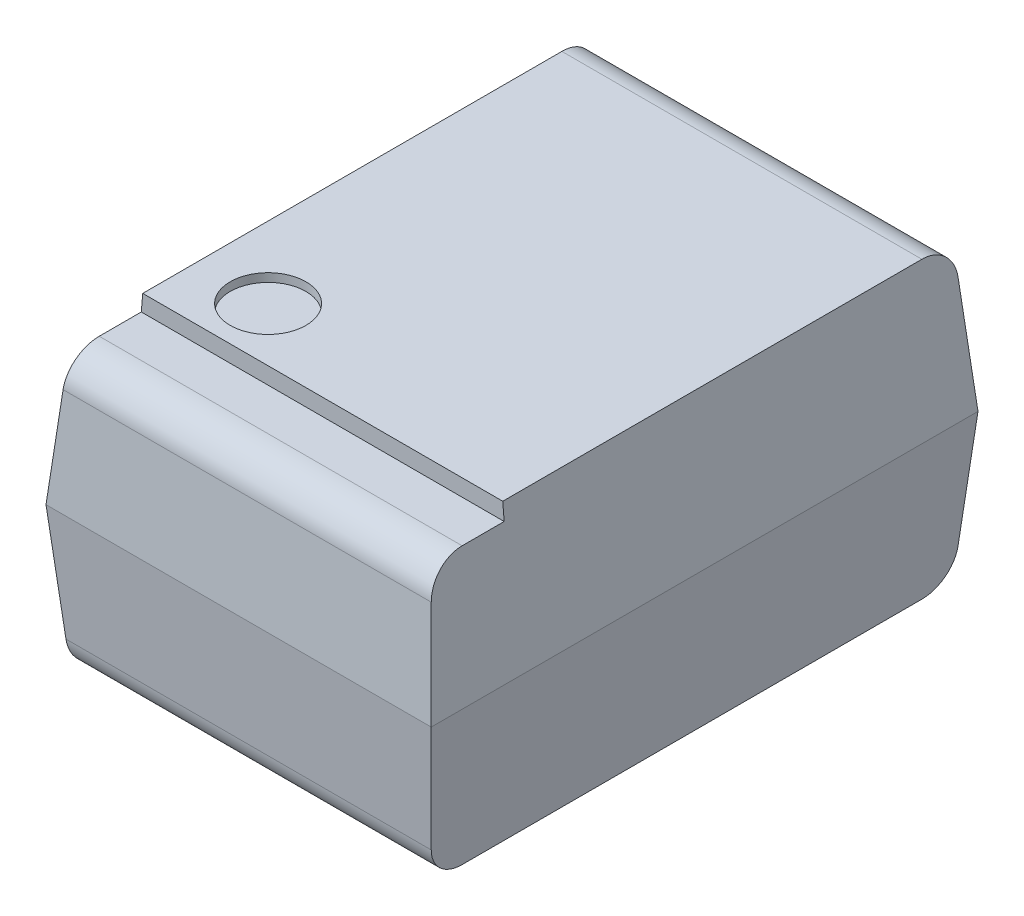
ISO-10303-21;
HEADER;
FILE_DESCRIPTION(('STEP AP214'),'2;1');
FILE_NAME('part.step','',(''),(''),'','','');
FILE_SCHEMA(('AUTOMOTIVE_DESIGN { 1 0 10303 214 1 1 1 1 }'));
ENDSEC;
DATA;
#1=APPLICATION_CONTEXT('core data for automotive mechanical design processes');
#2=APPLICATION_PROTOCOL_DEFINITION('international standard','automotive_design',2000,#1);
#3=PRODUCT_CONTEXT('',#1,'mechanical');
#4=PRODUCT('Part','Part','',(#3));
#5=PRODUCT_RELATED_PRODUCT_CATEGORY('part','',(#4));
#6=PRODUCT_DEFINITION_FORMATION('','',#4);
#7=PRODUCT_DEFINITION_CONTEXT('part definition',#1,'design');
#8=PRODUCT_DEFINITION('design','',#6,#7);
#9=PRODUCT_DEFINITION_SHAPE('','',#8);
#10=(LENGTH_UNIT() NAMED_UNIT(*) SI_UNIT(.MILLI.,.METRE.));
#11=(NAMED_UNIT(*) PLANE_ANGLE_UNIT() SI_UNIT($,.RADIAN.));
#12=(NAMED_UNIT(*) SI_UNIT($,.STERADIAN.) SOLID_ANGLE_UNIT());
#13=UNCERTAINTY_MEASURE_WITH_UNIT(LENGTH_MEASURE(1.E-05),#10,'distance_accuracy_value','');
#14=(GEOMETRIC_REPRESENTATION_CONTEXT(3) GLOBAL_UNCERTAINTY_ASSIGNED_CONTEXT((#13)) GLOBAL_UNIT_ASSIGNED_CONTEXT((#10,
#11,#12)) REPRESENTATION_CONTEXT('',''));
#15=CARTESIAN_POINT('',(0.,0.,0.));
#16=DIRECTION('',(0.,0.,1.));
#17=DIRECTION('',(1.,0.,0.));
#18=AXIS2_PLACEMENT_3D('',#15,#16,#17);
#19=CARTESIAN_POINT('',(0.,-1.65,0.));
#20=DIRECTION('',(0.,1.,0.));
#21=DIRECTION('',(0.,0.,1.));
#22=AXIS2_PLACEMENT_3D('',#19,#20,#21);
#23=PLANE('',#22);
#24=CARTESIAN_POINT('',(0.,-1.65,0.));
#25=DIRECTION('',(0.,1.,0.));
#26=DIRECTION('',(0.,0.,1.));
#27=AXIS2_PLACEMENT_3D('',#24,#25,#26);
#28=CIRCLE('',#27,1.5);
#29=CARTESIAN_POINT('',(0.,-1.65,1.5));
#30=VERTEX_POINT('',#29);
#31=EDGE_CURVE('E20',#30,#30,#28,.F.);
#32=ORIENTED_EDGE('',*,*,#31,.T.);
#33=EDGE_LOOP('',(#32));
#34=FACE_BOUND('',#33,.T.);
#35=ADVANCED_FACE('F17',(#34),#23,.F.);
#36=CARTESIAN_POINT('',(2.29,0.,3.25));
#37=DIRECTION('',(0.,-0.0854011413464188,0.996346649041753));
#38=DIRECTION('',(0.,-0.996346649041753,-0.0854011413464188));
#39=AXIS2_PLACEMENT_3D('',#36,#37,#38);
#40=PLANE('',#39);
#41=DIRECTION('',(-1.,0.,0.));
#42=VECTOR('',#41,1.);
#43=CARTESIAN_POINT('',(1.145,-1.38416045653897,3.13135767515367));
#44=LINE('',#43,#42);
#45=CARTESIAN_POINT('',(2.17135767515393,-1.38416045653877,3.13135767515372));
#46=VERTEX_POINT('',#45);
#47=CARTESIAN_POINT('',(-2.17135767515393,-1.38416045653877,3.13135767515372));
#48=VERTEX_POINT('',#47);
#49=EDGE_CURVE('E143',#46,#48,#44,.T.);
#50=ORIENTED_EDGE('',*,*,#49,.F.);
#51=DIRECTION('',(0.0850914041694685,0.992733048645463,0.0850914041695941));
#52=VECTOR('',#51,1.);
#53=CARTESIAN_POINT('',(2.171357675154,-1.38416045653899,3.13135767515383));
#54=LINE('',#53,#52);
#55=CARTESIAN_POINT('',(2.29,0.,3.25));
#56=VERTEX_POINT('',#55);
#57=EDGE_CURVE('E106',#46,#56,#54,.T.);
#58=ORIENTED_EDGE('',*,*,#57,.T.);
#59=DIRECTION('',(1.,0.,0.));
#60=VECTOR('',#59,1.);
#61=CARTESIAN_POINT('',(-2.29,0.,3.25));
#62=LINE('',#61,#60);
#63=CARTESIAN_POINT('',(-2.29,0.,3.25));
#64=VERTEX_POINT('',#63);
#65=EDGE_CURVE('E120',#64,#56,#62,.T.);
#66=ORIENTED_EDGE('',*,*,#65,.F.);
#67=DIRECTION('',(0.0850914041694688,-0.992733048645463,-0.0850914041695941));
#68=VECTOR('',#67,1.);
#69=CARTESIAN_POINT('',(-2.29,0.,3.25));
#70=LINE('',#69,#68);
#71=EDGE_CURVE('E111',#64,#48,#70,.T.);
#72=ORIENTED_EDGE('',*,*,#71,.T.);
#73=EDGE_LOOP('',(#50,#58,#66,#72));
#74=FACE_BOUND('',#73,.T.);
#75=ADVANCED_FACE('F121',(#74),#40,.T.);
#76=CARTESIAN_POINT('',(-2.29,0.,3.25));
#77=DIRECTION('',(0.,0.0854011413464188,0.996346649041753));
#78=DIRECTION('',(0.,-0.996346649041753,0.0854011413464188));
#79=AXIS2_PLACEMENT_3D('',#76,#77,#78);
#80=PLANE('',#79);
#81=DIRECTION('',(-1.,0.,0.));
#82=VECTOR('',#81,1.);
#83=CARTESIAN_POINT('',(-2.2905,1.18416045653897,3.14850053229667));
#84=LINE('',#83,#82);
#85=CARTESIAN_POINT('',(-2.18850053229686,1.18416045653877,3.14850053229669));
#86=VERTEX_POINT('',#85);
#87=CARTESIAN_POINT('',(2.18850053229686,1.18416045653877,3.14850053229669));
#88=VERTEX_POINT('',#87);
#89=EDGE_CURVE('E136',#86,#88,#84,.F.);
#90=ORIENTED_EDGE('',*,*,#89,.F.);
#91=DIRECTION('',(-0.0850914041693264,-0.992733048645475,0.0850914041695951));
#92=VECTOR('',#91,1.);
#93=CARTESIAN_POINT('',(-2.188500532297,1.18416045653897,3.14850053229668));
#94=LINE('',#93,#92);
#95=EDGE_CURVE('E129',#86,#64,#94,.T.);
#96=ORIENTED_EDGE('',*,*,#95,.T.);
#97=ORIENTED_EDGE('',*,*,#65,.T.);
#98=DIRECTION('',(-0.0850914041693268,0.992733048645475,-0.0850914041695951));
#99=VECTOR('',#98,1.);
#100=CARTESIAN_POINT('',(2.29,0.,3.25));
#101=LINE('',#100,#99);
#102=EDGE_CURVE('E125',#56,#88,#101,.T.);
#103=ORIENTED_EDGE('',*,*,#102,.T.);
#104=EDGE_LOOP('',(#90,#96,#97,#103));
#105=FACE_BOUND('',#104,.T.);
#106=ADVANCED_FACE('F134',(#105),#80,.T.);
#107=CARTESIAN_POINT('',(0.,-10.43771546495,0.));
#108=DIRECTION('',(0.,1.,0.));
#109=DIRECTION('',(0.,0.,1.));
#110=AXIS2_PLACEMENT_3D('',#107,#108,#109);
#111=CYLINDRICAL_SURFACE('',#110,1.5);
#112=ORIENTED_EDGE('',*,*,#31,.F.);
#113=EDGE_LOOP('',(#112));
#114=FACE_BOUND('',#113,.T.);
#115=CARTESIAN_POINT('',(0.,-1.75,0.));
#116=DIRECTION('',(0.,1.,0.));
#117=DIRECTION('',(0.,0.,1.));
#118=AXIS2_PLACEMENT_3D('',#115,#116,#117);
#119=CIRCLE('',#118,1.5);
#120=CARTESIAN_POINT('',(0.,-1.75,1.5));
#121=VERTEX_POINT('',#120);
#122=EDGE_CURVE('E171',#121,#121,#119,.F.);
#123=ORIENTED_EDGE('',*,*,#122,.T.);
#124=EDGE_LOOP('',(#123));
#125=FACE_BOUND('',#124,.T.);
#126=ADVANCED_FACE('F295',(#114,#125),#111,.F.);
#127=CARTESIAN_POINT('',(-1.145,-1.35,-2.732819015537));
#128=DIRECTION('',(1.,0.,0.));
#129=DIRECTION('',(0.,0.,-1.));
#130=AXIS2_PLACEMENT_3D('',#127,#128,#129);
#131=CYLINDRICAL_SURFACE('',#130,0.4);
#132=CARTESIAN_POINT('',(2.17428571428574,-1.35,-2.732819015537));
#133=DIRECTION('',(0.996346649041753,-0.0854011413464188,0.));
#134=DIRECTION('',(0.0854011413464188,0.996346649041753,0.));
#135=AXIS2_PLACEMENT_3D('',#132,#133,#134);
#136=ELLIPSE('',#135,0.401466698748578,0.4);
#137=CARTESIAN_POINT('',(2.17135767515384,-1.38416045653876,-3.13135767515381));
#138=VERTEX_POINT('',#137);
#139=CARTESIAN_POINT('',(2.14000000000003,-1.75,-2.732819015537));
#140=VERTEX_POINT('',#139);
#141=EDGE_CURVE('E183',#138,#140,#136,.F.);
#142=ORIENTED_EDGE('',*,*,#141,.T.);
#143=DIRECTION('',(1.,0.,0.));
#144=VECTOR('',#143,1.);
#145=CARTESIAN_POINT('',(0.,-1.75,-2.732819015537));
#146=LINE('',#145,#144);
#147=CARTESIAN_POINT('',(-2.14000000000003,-1.75,-2.732819015537));
#148=VERTEX_POINT('',#147);
#149=EDGE_CURVE('E174',#140,#148,#146,.F.);
#150=ORIENTED_EDGE('',*,*,#149,.T.);
#151=CARTESIAN_POINT('',(-2.17428571428574,-1.35,-2.732819015537));
#152=DIRECTION('',(-0.996346649041753,-0.0854011413464188,0.));
#153=DIRECTION('',(0.0854011413464188,-0.996346649041753,0.));
#154=AXIS2_PLACEMENT_3D('',#151,#152,#153);
#155=ELLIPSE('',#154,0.401466698748578,0.4);
#156=CARTESIAN_POINT('',(-2.17135767515393,-1.38416045653878,-3.13135767515376));
#157=VERTEX_POINT('',#156);
#158=EDGE_CURVE('E91',#148,#157,#155,.F.);
#159=ORIENTED_EDGE('',*,*,#158,.T.);
#160=DIRECTION('',(1.,0.,0.));
#161=VECTOR('',#160,1.);
#162=CARTESIAN_POINT('',(-2.29,-1.38416045653899,-3.13135767515383));
#163=LINE('',#162,#161);
#164=EDGE_CURVE('E187',#138,#157,#163,.F.);
#165=ORIENTED_EDGE('',*,*,#164,.F.);
#166=EDGE_LOOP('',(#142,#150,#159,#165));
#167=FACE_BOUND('',#166,.T.);
#168=ADVANCED_FACE('F186',(#167),#131,.T.);
#169=CARTESIAN_POINT('',(1.145,-1.35,2.732819015537));
#170=DIRECTION('',(-1.,0.,0.));
#171=DIRECTION('',(0.,-1.,0.));
#172=AXIS2_PLACEMENT_3D('',#169,#170,#171);
#173=CYLINDRICAL_SURFACE('',#172,0.4);
#174=CARTESIAN_POINT('',(-2.17428571428574,-1.35,2.732819015537));
#175=DIRECTION('',(-0.996346649041753,-0.0854011413464188,0.));
#176=DIRECTION('',(-0.0854011413464188,0.996346649041753,0.));
#177=AXIS2_PLACEMENT_3D('',#174,#175,#176);
#178=ELLIPSE('',#177,0.401466698748578,0.4);
#179=CARTESIAN_POINT('',(-2.14000000000003,-1.75,2.732819015537));
#180=VERTEX_POINT('',#179);
#181=EDGE_CURVE('E116',#48,#180,#178,.F.);
#182=ORIENTED_EDGE('',*,*,#181,.T.);
#183=DIRECTION('',(1.,0.,0.));
#184=VECTOR('',#183,1.);
#185=CARTESIAN_POINT('',(0.,-1.75,2.732819015537));
#186=LINE('',#185,#184);
#187=CARTESIAN_POINT('',(2.14000000000003,-1.75,2.732819015537));
#188=VERTEX_POINT('',#187);
#189=EDGE_CURVE('E202',#180,#188,#186,.T.);
#190=ORIENTED_EDGE('',*,*,#189,.T.);
#191=CARTESIAN_POINT('',(2.17428571428573,-1.35,2.732819015537));
#192=DIRECTION('',(0.996346649041753,-0.0854011413464188,0.));
#193=DIRECTION('',(-0.0854011413464188,-0.996346649041753,0.));
#194=AXIS2_PLACEMENT_3D('',#191,#192,#193);
#195=ELLIPSE('',#194,0.401466698748578,0.4);
#196=EDGE_CURVE('E180',#188,#46,#195,.F.);
#197=ORIENTED_EDGE('',*,*,#196,.T.);
#198=ORIENTED_EDGE('',*,*,#49,.T.);
#199=EDGE_LOOP('',(#182,#190,#197,#198));
#200=FACE_BOUND('',#199,.T.);
#201=ADVANCED_FACE('F304',(#200),#173,.T.);
#202=CARTESIAN_POINT('',(-2.2905,1.15,2.74996187268));
#203=DIRECTION('',(-1.,0.,0.));
#204=DIRECTION('',(0.,0.,1.));
#205=AXIS2_PLACEMENT_3D('',#202,#203,#204);
#206=CYLINDRICAL_SURFACE('',#205,0.4);
#207=CARTESIAN_POINT('',(-2.19142857142859,1.15,2.74996187268));
#208=DIRECTION('',(-0.996346649041753,0.0854011413464188,0.));
#209=DIRECTION('',(-0.0854011413464188,-0.996346649041753,0.));
#210=AXIS2_PLACEMENT_3D('',#207,#208,#209);
#211=ELLIPSE('',#210,0.401466698748578,0.4);
#212=CARTESIAN_POINT('',(-2.15714285714294,1.55,2.74996187268));
#213=VERTEX_POINT('',#212);
#214=EDGE_CURVE('E175',#213,#86,#211,.F.);
#215=ORIENTED_EDGE('',*,*,#214,.T.);
#216=ORIENTED_EDGE('',*,*,#89,.T.);
#217=CARTESIAN_POINT('',(2.19142857142859,1.15,2.74996187268));
#218=DIRECTION('',(0.996346649041753,0.0854011413464188,0.));
#219=DIRECTION('',(-0.0854011413464188,0.996346649041753,0.));
#220=AXIS2_PLACEMENT_3D('',#217,#218,#219);
#221=ELLIPSE('',#220,0.401466698748578,0.4);
#222=CARTESIAN_POINT('',(2.15714285714294,1.55,2.74996187268));
#223=VERTEX_POINT('',#222);
#224=EDGE_CURVE('E177',#88,#223,#221,.F.);
#225=ORIENTED_EDGE('',*,*,#224,.T.);
#226=DIRECTION('',(1.,0.,0.));
#227=VECTOR('',#226,1.);
#228=CARTESIAN_POINT('',(-2.291,1.55,2.74996187268));
#229=LINE('',#228,#227);
#230=EDGE_CURVE('E199',#223,#213,#229,.F.);
#231=ORIENTED_EDGE('',*,*,#230,.T.);
#232=EDGE_LOOP('',(#215,#216,#225,#231));
#233=FACE_BOUND('',#232,.T.);
#234=ADVANCED_FACE('F342',(#233),#206,.T.);
#235=CARTESIAN_POINT('',(-2.29,0.,-3.25));
#236=DIRECTION('',(0.,-0.0854011413464188,-0.996346649041753));
#237=DIRECTION('',(0.,0.996346649041753,-0.0854011413464188));
#238=AXIS2_PLACEMENT_3D('',#235,#236,#237);
#239=PLANE('',#238);
#240=ORIENTED_EDGE('',*,*,#164,.T.);
#241=DIRECTION('',(-0.0850914041694685,0.992733048645463,-0.0850914041695941));
#242=VECTOR('',#241,1.);
#243=CARTESIAN_POINT('',(-2.171357675154,-1.38416045653899,-3.13135767515383));
#244=LINE('',#243,#242);
#245=CARTESIAN_POINT('',(-2.29,0.,-3.25));
#246=VERTEX_POINT('',#245);
#247=EDGE_CURVE('E98',#157,#246,#244,.T.);
#248=ORIENTED_EDGE('',*,*,#247,.T.);
#249=DIRECTION('',(1.,0.,0.));
#250=VECTOR('',#249,1.);
#251=CARTESIAN_POINT('',(2.29,0.,-3.25));
#252=LINE('',#251,#250);
#253=CARTESIAN_POINT('',(2.29,0.,-3.25));
#254=VERTEX_POINT('',#253);
#255=EDGE_CURVE('E230',#254,#246,#252,.F.);
#256=ORIENTED_EDGE('',*,*,#255,.F.);
#257=DIRECTION('',(0.0850914041695941,0.992733048645463,-0.0850914041694685));
#258=VECTOR('',#257,1.);
#259=CARTESIAN_POINT('',(2.17135767515382,-1.38416045653899,-3.131357675154));
#260=LINE('',#259,#258);
#261=EDGE_CURVE('E194',#138,#254,#260,.T.);
#262=ORIENTED_EDGE('',*,*,#261,.F.);
#263=EDGE_LOOP('',(#240,#248,#256,#262));
#264=FACE_BOUND('',#263,.T.);
#265=ADVANCED_FACE('F192',(#264),#239,.T.);
#266=CARTESIAN_POINT('',(0.,-1.75,0.));
#267=DIRECTION('',(0.,1.,0.));
#268=DIRECTION('',(0.,0.,1.));
#269=AXIS2_PLACEMENT_3D('',#266,#267,#268);
#270=PLANE('',#269);
#271=ORIENTED_EDGE('',*,*,#189,.F.);
#272=DIRECTION('',(0.,0.,1.));
#273=VECTOR('',#272,1.);
#274=CARTESIAN_POINT('',(-2.14000000000003,-1.75,3.25));
#275=LINE('',#274,#273);
#276=EDGE_CURVE('E170',#148,#180,#275,.T.);
#277=ORIENTED_EDGE('',*,*,#276,.F.);
#278=ORIENTED_EDGE('',*,*,#149,.F.);
#279=DIRECTION('',(0.,0.,1.));
#280=VECTOR('',#279,1.);
#281=CARTESIAN_POINT('',(2.14000000000003,-1.75,-3.25));
#282=LINE('',#281,#280);
#283=EDGE_CURVE('E224',#188,#140,#282,.F.);
#284=ORIENTED_EDGE('',*,*,#283,.F.);
#285=EDGE_LOOP('',(#271,#277,#278,#284));
#286=FACE_BOUND('',#285,.T.);
#287=ORIENTED_EDGE('',*,*,#122,.F.);
#288=EDGE_LOOP('',(#287));
#289=FACE_BOUND('',#288,.T.);
#290=ADVANCED_FACE('F288',(#286,#289),#270,.F.);
#291=CARTESIAN_POINT('',(0.,1.65,0.));
#292=DIRECTION('',(0.,1.,0.));
#293=DIRECTION('',(0.,0.,1.));
#294=AXIS2_PLACEMENT_3D('',#291,#292,#293);
#295=PLANE('',#294);
#296=CARTESIAN_POINT('',(-1.29,1.65,1.61));
#297=DIRECTION('',(0.,-1.,0.));
#298=DIRECTION('',(0.,0.,-1.));
#299=AXIS2_PLACEMENT_3D('',#296,#297,#298);
#300=CIRCLE('',#299,0.45);
#301=CARTESIAN_POINT('',(-1.29,1.65,1.16));
#302=VERTEX_POINT('',#301);
#303=EDGE_CURVE('E166',#302,#302,#300,.F.);
#304=ORIENTED_EDGE('',*,*,#303,.T.);
#305=EDGE_LOOP('',(#304));
#306=FACE_BOUND('',#305,.T.);
#307=ADVANCED_FACE('F291',(#306),#295,.T.);
#308=CARTESIAN_POINT('',(-2.291,1.55,2.25));
#309=DIRECTION('',(0.,-1.,0.));
#310=DIRECTION('',(0.,0.,-1.));
#311=AXIS2_PLACEMENT_3D('',#308,#309,#310);
#312=PLANE('',#311);
#313=DIRECTION('',(-1.,0.,0.));
#314=VECTOR('',#313,1.);
#315=CARTESIAN_POINT('',(-2.291,1.55,2.25));
#316=LINE('',#315,#314);
#317=CARTESIAN_POINT('',(2.15714285714296,1.55,2.25));
#318=VERTEX_POINT('',#317);
#319=CARTESIAN_POINT('',(-2.15714285714292,1.55,2.25));
#320=VERTEX_POINT('',#319);
#321=EDGE_CURVE('E169',#318,#320,#316,.T.);
#322=ORIENTED_EDGE('',*,*,#321,.T.);
#323=DIRECTION('',(0.,0.,-1.));
#324=VECTOR('',#323,1.);
#325=CARTESIAN_POINT('',(-2.157142857143,1.55,2.25));
#326=LINE('',#325,#324);
#327=EDGE_CURVE('E201',#213,#320,#326,.T.);
#328=ORIENTED_EDGE('',*,*,#327,.F.);
#329=ORIENTED_EDGE('',*,*,#230,.F.);
#330=DIRECTION('',(0.,0.,-1.));
#331=VECTOR('',#330,1.);
#332=CARTESIAN_POINT('',(2.157142857143,1.55,2.25));
#333=LINE('',#332,#331);
#334=EDGE_CURVE('E207',#318,#223,#333,.F.);
#335=ORIENTED_EDGE('',*,*,#334,.F.);
#336=EDGE_LOOP('',(#322,#328,#329,#335));
#337=FACE_BOUND('',#336,.T.);
#338=ADVANCED_FACE('F333',(#337),#312,.F.);
#339=CARTESIAN_POINT('',(2.29,0.,-3.25));
#340=DIRECTION('',(0.996346649041753,-0.0854011413464188,0.));
#341=DIRECTION('',(0.0854011413464188,0.996346649041753,0.));
#342=AXIS2_PLACEMENT_3D('',#339,#340,#341);
#343=PLANE('',#342);
#344=DIRECTION('',(0.,0.,1.));
#345=VECTOR('',#344,1.);
#346=CARTESIAN_POINT('',(2.29,0.,3.25));
#347=LINE('',#346,#345);
#348=EDGE_CURVE('E233',#56,#254,#347,.F.);
#349=ORIENTED_EDGE('',*,*,#348,.F.);
#350=ORIENTED_EDGE('',*,*,#57,.F.);
#351=ORIENTED_EDGE('',*,*,#196,.F.);
#352=ORIENTED_EDGE('',*,*,#283,.T.);
#353=ORIENTED_EDGE('',*,*,#141,.F.);
#354=ORIENTED_EDGE('',*,*,#261,.T.);
#355=EDGE_LOOP('',(#349,#350,#351,#352,#353,#354));
#356=FACE_BOUND('',#355,.T.);
#357=ADVANCED_FACE('F286',(#356),#343,.T.);
#358=CARTESIAN_POINT('',(2.29,0.,-3.25));
#359=DIRECTION('',(0.,0.0854011413464188,-0.996346649041753));
#360=DIRECTION('',(0.,0.996346649041753,0.0854011413464188));
#361=AXIS2_PLACEMENT_3D('',#358,#359,#360);
#362=PLANE('',#361);
#363=DIRECTION('',(-1.,0.,0.));
#364=VECTOR('',#363,1.);
#365=CARTESIAN_POINT('',(1.145,1.38416045653897,-3.13135767515367));
#366=LINE('',#365,#364);
#367=CARTESIAN_POINT('',(2.17135767515385,1.38416045653875,-3.13135767515377));
#368=VERTEX_POINT('',#367);
#369=CARTESIAN_POINT('',(-2.17135767515393,1.38416045653877,-3.13135767515372));
#370=VERTEX_POINT('',#369);
#371=EDGE_CURVE('E164',#368,#370,#366,.T.);
#372=ORIENTED_EDGE('',*,*,#371,.F.);
#373=DIRECTION('',(-0.0850914041695941,0.992733048645463,0.0850914041694682));
#374=VECTOR('',#373,1.);
#375=CARTESIAN_POINT('',(2.29,0.,-3.25));
#376=LINE('',#375,#374);
#377=EDGE_CURVE('E236',#254,#368,#376,.T.);
#378=ORIENTED_EDGE('',*,*,#377,.F.);
#379=ORIENTED_EDGE('',*,*,#255,.T.);
#380=DIRECTION('',(0.0850914041694688,0.992733048645463,0.0850914041695942));
#381=VECTOR('',#380,1.);
#382=CARTESIAN_POINT('',(-2.29,0.,-3.25));
#383=LINE('',#382,#381);
#384=EDGE_CURVE('E131',#246,#370,#383,.T.);
#385=ORIENTED_EDGE('',*,*,#384,.T.);
#386=EDGE_LOOP('',(#372,#378,#379,#385));
#387=FACE_BOUND('',#386,.T.);
#388=ADVANCED_FACE('F283',(#387),#362,.T.);
#389=CARTESIAN_POINT('',(-2.29,0.,3.25));
#390=DIRECTION('',(-0.996346649041753,-0.0854011413464188,0.));
#391=DIRECTION('',(0.0854011413464188,-0.996346649041753,0.));
#392=AXIS2_PLACEMENT_3D('',#389,#390,#391);
#393=PLANE('',#392);
#394=ORIENTED_EDGE('',*,*,#181,.F.);
#395=ORIENTED_EDGE('',*,*,#71,.F.);
#396=DIRECTION('',(0.,0.,1.));
#397=VECTOR('',#396,1.);
#398=CARTESIAN_POINT('',(-2.29,0.,-3.25));
#399=LINE('',#398,#397);
#400=EDGE_CURVE('E114',#246,#64,#399,.T.);
#401=ORIENTED_EDGE('',*,*,#400,.F.);
#402=ORIENTED_EDGE('',*,*,#247,.F.);
#403=ORIENTED_EDGE('',*,*,#158,.F.);
#404=ORIENTED_EDGE('',*,*,#276,.T.);
#405=EDGE_LOOP('',(#394,#395,#401,#402,#403,#404));
#406=FACE_BOUND('',#405,.T.);
#407=ADVANCED_FACE('F112',(#406),#393,.T.);
#408=CARTESIAN_POINT('',(-1.29,10.437715464954,1.61));
#409=DIRECTION('',(0.,-1.,0.));
#410=DIRECTION('',(0.,0.,-1.));
#411=AXIS2_PLACEMENT_3D('',#408,#409,#410);
#412=CYLINDRICAL_SURFACE('',#411,0.45);
#413=ORIENTED_EDGE('',*,*,#303,.F.);
#414=EDGE_LOOP('',(#413));
#415=FACE_BOUND('',#414,.T.);
#416=CARTESIAN_POINT('',(-1.29,1.75,1.61));
#417=DIRECTION('',(0.,-1.,0.));
#418=DIRECTION('',(0.,0.,-1.));
#419=AXIS2_PLACEMENT_3D('',#416,#417,#418);
#420=CIRCLE('',#419,0.45);
#421=CARTESIAN_POINT('',(-1.29,1.75,1.16));
#422=VERTEX_POINT('',#421);
#423=EDGE_CURVE('E132',#422,#422,#420,.T.);
#424=ORIENTED_EDGE('',*,*,#423,.F.);
#425=EDGE_LOOP('',(#424));
#426=FACE_BOUND('',#425,.T.);
#427=ADVANCED_FACE('F322',(#415,#426),#412,.F.);
#428=CARTESIAN_POINT('',(-2.291,1.75,2.25));
#429=DIRECTION('',(0.,0.,-1.));
#430=DIRECTION('',(-1.,0.,0.));
#431=AXIS2_PLACEMENT_3D('',#428,#429,#430);
#432=PLANE('',#431);
#433=DIRECTION('',(-0.0854011413464188,0.996346649041753,0.));
#434=VECTOR('',#433,1.);
#435=CARTESIAN_POINT('',(2.29,0.,2.25));
#436=LINE('',#435,#434);
#437=CARTESIAN_POINT('',(2.14000000000001,1.75,2.25));
#438=VERTEX_POINT('',#437);
#439=EDGE_CURVE('E165',#438,#318,#436,.F.);
#440=ORIENTED_EDGE('',*,*,#439,.F.);
#441=DIRECTION('',(1.,0.,0.));
#442=VECTOR('',#441,1.);
#443=CARTESIAN_POINT('',(0.,1.75,2.25));
#444=LINE('',#443,#442);
#445=CARTESIAN_POINT('',(-2.14000000000001,1.75,2.25));
#446=VERTEX_POINT('',#445);
#447=EDGE_CURVE('E158',#446,#438,#444,.T.);
#448=ORIENTED_EDGE('',*,*,#447,.F.);
#449=DIRECTION('',(-0.0854011413464188,-0.996346649041753,0.));
#450=VECTOR('',#449,1.);
#451=CARTESIAN_POINT('',(-2.29,0.,2.25));
#452=LINE('',#451,#450);
#453=EDGE_CURVE('E160',#320,#446,#452,.F.);
#454=ORIENTED_EDGE('',*,*,#453,.F.);
#455=ORIENTED_EDGE('',*,*,#321,.F.);
#456=EDGE_LOOP('',(#440,#448,#454,#455));
#457=FACE_BOUND('',#456,.T.);
#458=ADVANCED_FACE('F319',(#457),#432,.F.);
#459=CARTESIAN_POINT('',(2.29,0.,3.25));
#460=DIRECTION('',(0.996346649041753,0.0854011413464188,0.));
#461=DIRECTION('',(-0.0854011413464188,0.996346649041753,0.));
#462=AXIS2_PLACEMENT_3D('',#459,#460,#461);
#463=PLANE('',#462);
#464=ORIENTED_EDGE('',*,*,#224,.F.);
#465=ORIENTED_EDGE('',*,*,#102,.F.);
#466=ORIENTED_EDGE('',*,*,#348,.T.);
#467=ORIENTED_EDGE('',*,*,#377,.T.);
#468=CARTESIAN_POINT('',(2.17428571428574,1.35,-2.732819015537));
#469=DIRECTION('',(0.996346649041753,0.0854011413464188,0.));
#470=DIRECTION('',(-0.0854011413464188,0.996346649041753,0.));
#471=AXIS2_PLACEMENT_3D('',#468,#469,#470);
#472=ELLIPSE('',#471,0.401466698748578,0.4);
#473=CARTESIAN_POINT('',(2.14000000000002,1.75,-2.732819015537));
#474=VERTEX_POINT('',#473);
#475=EDGE_CURVE('E161',#474,#368,#472,.F.);
#476=ORIENTED_EDGE('',*,*,#475,.F.);
#477=DIRECTION('',(0.,0.,1.));
#478=VECTOR('',#477,1.);
#479=CARTESIAN_POINT('',(2.14,1.75,0.));
#480=LINE('',#479,#478);
#481=EDGE_CURVE('E257',#438,#474,#480,.F.);
#482=ORIENTED_EDGE('',*,*,#481,.F.);
#483=ORIENTED_EDGE('',*,*,#439,.T.);
#484=ORIENTED_EDGE('',*,*,#334,.T.);
#485=EDGE_LOOP('',(#464,#465,#466,#467,#476,#482,#483,#484));
#486=FACE_BOUND('',#485,.T.);
#487=ADVANCED_FACE('F279',(#486),#463,.T.);
#488=CARTESIAN_POINT('',(1.145,1.35,-2.732819015537));
#489=DIRECTION('',(-1.,0.,0.));
#490=DIRECTION('',(0.,0.,1.));
#491=AXIS2_PLACEMENT_3D('',#488,#489,#490);
#492=CYLINDRICAL_SURFACE('',#491,0.4);
#493=CARTESIAN_POINT('',(-2.17428571428574,1.35,-2.732819015537));
#494=DIRECTION('',(-0.996346649041753,0.0854011413464188,0.));
#495=DIRECTION('',(-0.0854011413464188,-0.996346649041753,0.));
#496=AXIS2_PLACEMENT_3D('',#493,#494,#495);
#497=ELLIPSE('',#496,0.401466698748578,0.4);
#498=CARTESIAN_POINT('',(-2.14000000000002,1.75,-2.732819015537));
#499=VERTEX_POINT('',#498);
#500=EDGE_CURVE('E35',#499,#370,#497,.T.);
#501=ORIENTED_EDGE('',*,*,#500,.F.);
#502=DIRECTION('',(1.,0.,0.));
#503=VECTOR('',#502,1.);
#504=CARTESIAN_POINT('',(0.,1.75,-2.732819015537));
#505=LINE('',#504,#503);
#506=EDGE_CURVE('E26',#474,#499,#505,.F.);
#507=ORIENTED_EDGE('',*,*,#506,.F.);
#508=ORIENTED_EDGE('',*,*,#475,.T.);
#509=ORIENTED_EDGE('',*,*,#371,.T.);
#510=EDGE_LOOP('',(#501,#507,#508,#509));
#511=FACE_BOUND('',#510,.T.);
#512=ADVANCED_FACE('F276',(#511),#492,.T.);
#513=CARTESIAN_POINT('',(-2.29,0.,-3.25));
#514=DIRECTION('',(-0.996346649041753,0.0854011413464188,0.));
#515=DIRECTION('',(-0.0854011413464188,-0.996346649041753,0.));
#516=AXIS2_PLACEMENT_3D('',#513,#514,#515);
#517=PLANE('',#516);
#518=ORIENTED_EDGE('',*,*,#214,.F.);
#519=ORIENTED_EDGE('',*,*,#327,.T.);
#520=ORIENTED_EDGE('',*,*,#453,.T.);
#521=DIRECTION('',(0.,0.,1.));
#522=VECTOR('',#521,1.);
#523=CARTESIAN_POINT('',(-2.14,1.75,0.));
#524=LINE('',#523,#522);
#525=EDGE_CURVE('E11',#499,#446,#524,.T.);
#526=ORIENTED_EDGE('',*,*,#525,.F.);
#527=ORIENTED_EDGE('',*,*,#500,.T.);
#528=ORIENTED_EDGE('',*,*,#384,.F.);
#529=ORIENTED_EDGE('',*,*,#400,.T.);
#530=ORIENTED_EDGE('',*,*,#95,.F.);
#531=EDGE_LOOP('',(#518,#519,#520,#526,#527,#528,#529,#530));
#532=FACE_BOUND('',#531,.T.);
#533=ADVANCED_FACE('F128',(#532),#517,.T.);
#534=CARTESIAN_POINT('',(0.,1.75,0.));
#535=DIRECTION('',(0.,1.,0.));
#536=DIRECTION('',(0.,0.,1.));
#537=AXIS2_PLACEMENT_3D('',#534,#535,#536);
#538=PLANE('',#537);
#539=ORIENTED_EDGE('',*,*,#506,.T.);
#540=ORIENTED_EDGE('',*,*,#525,.T.);
#541=ORIENTED_EDGE('',*,*,#447,.T.);
#542=ORIENTED_EDGE('',*,*,#481,.T.);
#543=EDGE_LOOP('',(#539,#540,#541,#542));
#544=FACE_BOUND('',#543,.T.);
#545=ORIENTED_EDGE('',*,*,#423,.T.);
#546=EDGE_LOOP('',(#545));
#547=FACE_BOUND('',#546,.T.);
#548=ADVANCED_FACE('F273',(#544,#547),#538,.T.);
#549=CLOSED_SHELL('',(#35,#75,#106,#126,#168,#201,#234,#265,#290,#307,#338,#357,#388,#407,#427,
#458,#487,#512,#533,#548));
#550=MANIFOLD_SOLID_BREP('B1',#549);
#551=ADVANCED_BREP_SHAPE_REPRESENTATION('',(#18,#550),#14);
#552=SHAPE_DEFINITION_REPRESENTATION(#9,#551);
ENDSEC;
END-ISO-10303-21;
